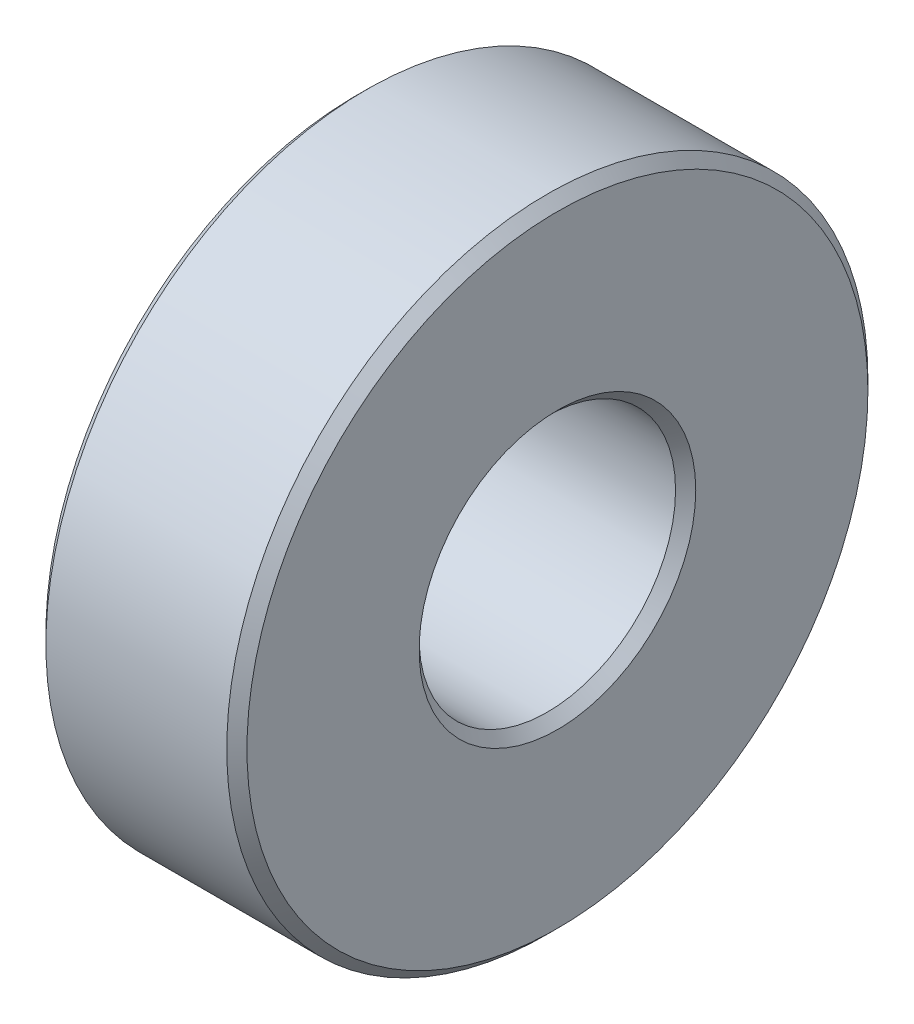
ISO-10303-21;
HEADER;
FILE_DESCRIPTION(('STEP AP214'),'2;1');
FILE_NAME('part.step','',(''),(''),'','','');
FILE_SCHEMA(('AUTOMOTIVE_DESIGN { 1 0 10303 214 1 1 1 1 }'));
ENDSEC;
DATA;
#1=APPLICATION_CONTEXT('core data for automotive mechanical design processes');
#2=APPLICATION_PROTOCOL_DEFINITION('international standard','automotive_design',2000,#1);
#3=PRODUCT_CONTEXT('',#1,'mechanical');
#4=PRODUCT('Part','Part','',(#3));
#5=PRODUCT_RELATED_PRODUCT_CATEGORY('part','',(#4));
#6=PRODUCT_DEFINITION_FORMATION('','',#4);
#7=PRODUCT_DEFINITION_CONTEXT('part definition',#1,'design');
#8=PRODUCT_DEFINITION('design','',#6,#7);
#9=PRODUCT_DEFINITION_SHAPE('','',#8);
#10=(LENGTH_UNIT() NAMED_UNIT(*) SI_UNIT(.MILLI.,.METRE.));
#11=(NAMED_UNIT(*) PLANE_ANGLE_UNIT() SI_UNIT($,.RADIAN.));
#12=(NAMED_UNIT(*) SI_UNIT($,.STERADIAN.) SOLID_ANGLE_UNIT());
#13=UNCERTAINTY_MEASURE_WITH_UNIT(LENGTH_MEASURE(1.E-05),#10,'distance_accuracy_value','');
#14=(GEOMETRIC_REPRESENTATION_CONTEXT(3) GLOBAL_UNCERTAINTY_ASSIGNED_CONTEXT((#13)) GLOBAL_UNIT_ASSIGNED_CONTEXT((#10,
#11,#12)) REPRESENTATION_CONTEXT('',''));
#15=CARTESIAN_POINT('',(0.,0.,0.));
#16=DIRECTION('',(0.,0.,1.));
#17=DIRECTION('',(1.,0.,0.));
#18=AXIS2_PLACEMENT_3D('',#15,#16,#17);
#19=CARTESIAN_POINT('',(2.489,0.,0.));
#20=DIRECTION('',(1.,0.,0.));
#21=DIRECTION('',(0.,0.,-1.));
#22=AXIS2_PLACEMENT_3D('',#19,#20,#21);
#23=PLANE('',#22);
#24=CARTESIAN_POINT('',(2.489,0.,0.));
#25=DIRECTION('',(1.,0.,0.));
#26=DIRECTION('',(0.,0.,-1.));
#27=AXIS2_PLACEMENT_3D('',#24,#25,#26);
#28=CIRCLE('',#27,3.425);
#29=CARTESIAN_POINT('',(2.489,0.,-3.425));
#30=VERTEX_POINT('',#29);
#31=EDGE_CURVE('E55',#30,#30,#28,.F.);
#32=ORIENTED_EDGE('',*,*,#31,.T.);
#33=EDGE_LOOP('',(#32));
#34=FACE_BOUND('',#33,.T.);
#35=CARTESIAN_POINT('',(2.489,0.,0.));
#36=DIRECTION('',(1.,0.,0.));
#37=DIRECTION('',(0.,0.,-1.));
#38=AXIS2_PLACEMENT_3D('',#35,#36,#37);
#39=CIRCLE('',#38,7.6875);
#40=CARTESIAN_POINT('',(2.489,0.,-7.6875));
#41=VERTEX_POINT('',#40);
#42=EDGE_CURVE('E60',#41,#41,#39,.T.);
#43=ORIENTED_EDGE('',*,*,#42,.T.);
#44=EDGE_LOOP('',(#43));
#45=FACE_BOUND('',#44,.T.);
#46=ADVANCED_FACE('F39',(#34,#45),#23,.T.);
#47=CARTESIAN_POINT('',(-2.489,0.,0.));
#48=DIRECTION('',(1.,0.,0.));
#49=DIRECTION('',(0.,0.,-1.));
#50=AXIS2_PLACEMENT_3D('',#47,#48,#49);
#51=PLANE('',#50);
#52=CARTESIAN_POINT('',(-2.489,0.,0.));
#53=DIRECTION('',(1.,0.,0.));
#54=DIRECTION('',(0.,0.,-1.));
#55=AXIS2_PLACEMENT_3D('',#52,#53,#54);
#56=CIRCLE('',#55,7.6875);
#57=CARTESIAN_POINT('',(-2.489,0.,-7.6875));
#58=VERTEX_POINT('',#57);
#59=EDGE_CURVE('E10',#58,#58,#56,.F.);
#60=ORIENTED_EDGE('',*,*,#59,.T.);
#61=EDGE_LOOP('',(#60));
#62=FACE_BOUND('',#61,.T.);
#63=CARTESIAN_POINT('',(-2.489,0.,0.));
#64=DIRECTION('',(1.,0.,0.));
#65=DIRECTION('',(0.,0.,-1.));
#66=AXIS2_PLACEMENT_3D('',#63,#64,#65);
#67=CIRCLE('',#66,3.175);
#68=CARTESIAN_POINT('',(-2.489,0.,-3.175));
#69=VERTEX_POINT('',#68);
#70=EDGE_CURVE('E66',#69,#69,#67,.T.);
#71=ORIENTED_EDGE('',*,*,#70,.T.);
#72=EDGE_LOOP('',(#71));
#73=FACE_BOUND('',#72,.T.);
#74=ADVANCED_FACE('F70',(#62,#73),#51,.F.);
#75=CARTESIAN_POINT('',(2.489,0.,0.));
#76=DIRECTION('',(-1.,0.,0.));
#77=DIRECTION('',(0.,0.,1.));
#78=AXIS2_PLACEMENT_3D('',#75,#76,#77);
#79=CYLINDRICAL_SURFACE('',#78,7.9375);
#80=CARTESIAN_POINT('',(-2.239,0.,0.));
#81=DIRECTION('',(1.,0.,0.));
#82=DIRECTION('',(0.,0.,-1.));
#83=AXIS2_PLACEMENT_3D('',#80,#81,#82);
#84=CIRCLE('',#83,7.9375);
#85=CARTESIAN_POINT('',(-2.239,0.,-7.9375));
#86=VERTEX_POINT('',#85);
#87=EDGE_CURVE('E47',#86,#86,#84,.T.);
#88=ORIENTED_EDGE('',*,*,#87,.T.);
#89=EDGE_LOOP('',(#88));
#90=FACE_BOUND('',#89,.T.);
#91=CARTESIAN_POINT('',(2.23899999999999,0.,0.));
#92=DIRECTION('',(1.,0.,0.));
#93=DIRECTION('',(0.,0.,-1.));
#94=AXIS2_PLACEMENT_3D('',#91,#92,#93);
#95=CIRCLE('',#94,7.9375);
#96=CARTESIAN_POINT('',(2.23899999999999,0.,-7.9375));
#97=VERTEX_POINT('',#96);
#98=EDGE_CURVE('E51',#97,#97,#95,.F.);
#99=ORIENTED_EDGE('',*,*,#98,.T.);
#100=EDGE_LOOP('',(#99));
#101=FACE_BOUND('',#100,.T.);
#102=ADVANCED_FACE('F75',(#90,#101),#79,.T.);
#103=CARTESIAN_POINT('',(2.489,0.,0.));
#104=DIRECTION('',(-1.,0.,0.));
#105=DIRECTION('',(0.,0.,1.));
#106=AXIS2_PLACEMENT_3D('',#103,#104,#105);
#107=CYLINDRICAL_SURFACE('',#106,3.175);
#108=CARTESIAN_POINT('',(2.239,0.,0.));
#109=DIRECTION('',(1.,0.,0.));
#110=DIRECTION('',(0.,0.,-1.));
#111=AXIS2_PLACEMENT_3D('',#108,#109,#110);
#112=CIRCLE('',#111,3.175);
#113=CARTESIAN_POINT('',(2.239,0.,-3.175));
#114=VERTEX_POINT('',#113);
#115=EDGE_CURVE('E63',#114,#114,#112,.T.);
#116=ORIENTED_EDGE('',*,*,#115,.T.);
#117=EDGE_LOOP('',(#116));
#118=FACE_BOUND('',#117,.T.);
#119=ORIENTED_EDGE('',*,*,#70,.F.);
#120=EDGE_LOOP('',(#119));
#121=FACE_BOUND('',#120,.T.);
#122=ADVANCED_FACE('F72',(#118,#121),#107,.F.);
#123=CARTESIAN_POINT('',(2.239,0.,0.));
#124=DIRECTION('',(1.,0.,0.));
#125=DIRECTION('',(0.,0.,-1.));
#126=AXIS2_PLACEMENT_3D('',#123,#124,#125);
#127=CONICAL_SURFACE('',#126,3.175,0.785398163397454);
#128=ORIENTED_EDGE('',*,*,#31,.F.);
#129=EDGE_LOOP('',(#128));
#130=FACE_BOUND('',#129,.T.);
#131=ORIENTED_EDGE('',*,*,#115,.F.);
#132=EDGE_LOOP('',(#131));
#133=FACE_BOUND('',#132,.T.);
#134=ADVANCED_FACE('F74',(#130,#133),#127,.F.);
#135=CARTESIAN_POINT('',(-2.239,0.,0.));
#136=DIRECTION('',(1.,0.,0.));
#137=DIRECTION('',(0.,0.,-1.));
#138=AXIS2_PLACEMENT_3D('',#135,#136,#137);
#139=CONICAL_SURFACE('',#138,7.9375,0.785398163397452);
#140=ORIENTED_EDGE('',*,*,#59,.F.);
#141=EDGE_LOOP('',(#140));
#142=FACE_BOUND('',#141,.T.);
#143=ORIENTED_EDGE('',*,*,#87,.F.);
#144=EDGE_LOOP('',(#143));
#145=FACE_BOUND('',#144,.T.);
#146=ADVANCED_FACE('F82',(#142,#145),#139,.T.);
#147=CARTESIAN_POINT('',(2.489,0.,0.));
#148=DIRECTION('',(-1.,0.,0.));
#149=DIRECTION('',(0.,0.,1.));
#150=AXIS2_PLACEMENT_3D('',#147,#148,#149);
#151=CONICAL_SURFACE('',#150,7.6875,0.785398163397445);
#152=ORIENTED_EDGE('',*,*,#98,.F.);
#153=EDGE_LOOP('',(#152));
#154=FACE_BOUND('',#153,.T.);
#155=ORIENTED_EDGE('',*,*,#42,.F.);
#156=EDGE_LOOP('',(#155));
#157=FACE_BOUND('',#156,.T.);
#158=ADVANCED_FACE('F42',(#154,#157),#151,.T.);
#159=CLOSED_SHELL('',(#46,#74,#102,#122,#134,#146,#158));
#160=MANIFOLD_SOLID_BREP('B2',#159);
#161=ADVANCED_BREP_SHAPE_REPRESENTATION('',(#18,#160),#14);
#162=SHAPE_DEFINITION_REPRESENTATION(#9,#161);
ENDSEC;
END-ISO-10303-21;
